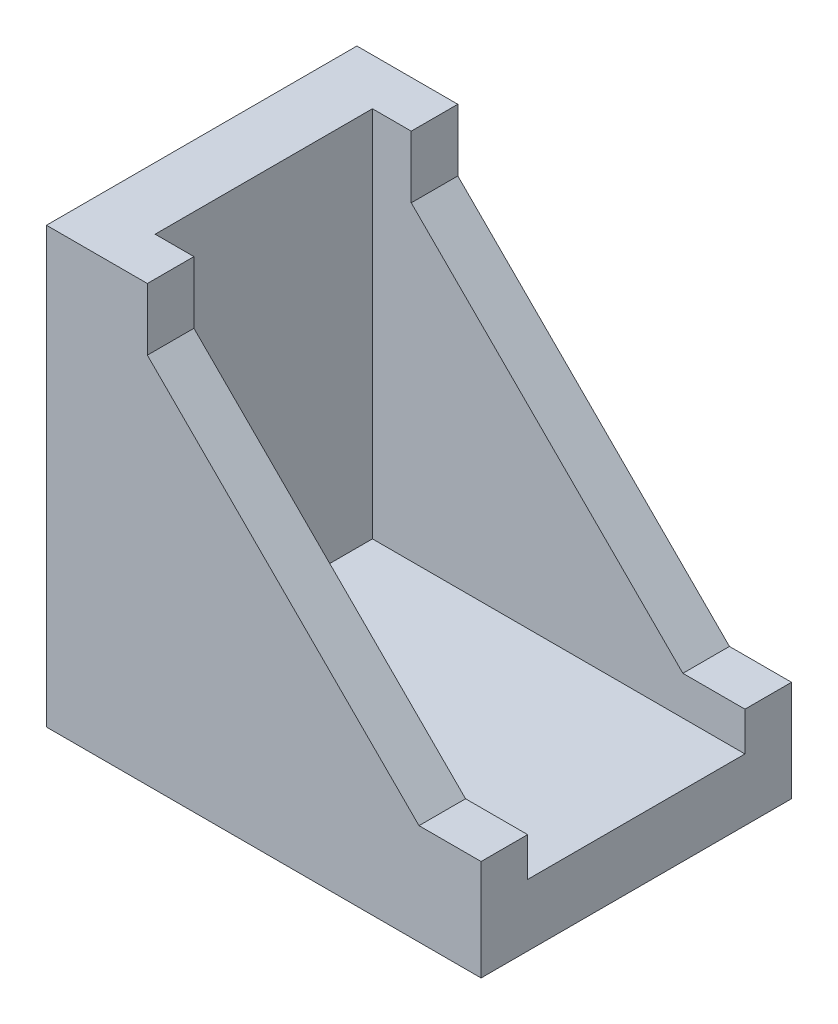
ISO-10303-21;
HEADER;
FILE_DESCRIPTION(('STEP AP214'),'2;1');
FILE_NAME('part.step','',(''),(''),'','','');
FILE_SCHEMA(('AUTOMOTIVE_DESIGN { 1 0 10303 214 1 1 1 1 }'));
ENDSEC;
DATA;
#1=APPLICATION_CONTEXT('core data for automotive mechanical design processes');
#2=APPLICATION_PROTOCOL_DEFINITION('international standard','automotive_design',2000,#1);
#3=PRODUCT_CONTEXT('',#1,'mechanical');
#4=PRODUCT('Part','Part','',(#3));
#5=PRODUCT_RELATED_PRODUCT_CATEGORY('part','',(#4));
#6=PRODUCT_DEFINITION_FORMATION('','',#4);
#7=PRODUCT_DEFINITION_CONTEXT('part definition',#1,'design');
#8=PRODUCT_DEFINITION('design','',#6,#7);
#9=PRODUCT_DEFINITION_SHAPE('','',#8);
#10=(LENGTH_UNIT() NAMED_UNIT(*) SI_UNIT(.MILLI.,.METRE.));
#11=(NAMED_UNIT(*) PLANE_ANGLE_UNIT() SI_UNIT($,.RADIAN.));
#12=(NAMED_UNIT(*) SI_UNIT($,.STERADIAN.) SOLID_ANGLE_UNIT());
#13=UNCERTAINTY_MEASURE_WITH_UNIT(LENGTH_MEASURE(1.E-05),#10,'distance_accuracy_value','');
#14=(GEOMETRIC_REPRESENTATION_CONTEXT(3) GLOBAL_UNCERTAINTY_ASSIGNED_CONTEXT((#13)) GLOBAL_UNIT_ASSIGNED_CONTEXT((#10,
#11,#12)) REPRESENTATION_CONTEXT('',''));
#15=CARTESIAN_POINT('',(0.,0.,0.));
#16=DIRECTION('',(0.,0.,1.));
#17=DIRECTION('',(1.,0.,0.));
#18=AXIS2_PLACEMENT_3D('',#15,#16,#17);
#19=CARTESIAN_POINT('',(14.,-7.5,20.));
#20=DIRECTION('',(0.,-1.,0.));
#21=DIRECTION('',(1.,0.,0.));
#22=AXIS2_PLACEMENT_3D('',#19,#20,#21);
#23=PLANE('',#22);
#24=DIRECTION('',(0.,0.,-1.));
#25=VECTOR('',#24,1.);
#26=CARTESIAN_POINT('',(10.,-7.5,20.));
#27=LINE('',#26,#25);
#28=CARTESIAN_POINT('',(10.,-7.5,3.));
#29=VERTEX_POINT('',#28);
#30=CARTESIAN_POINT('',(10.,-7.5,0.));
#31=VERTEX_POINT('',#30);
#32=EDGE_CURVE('E170',#29,#31,#27,.T.);
#33=ORIENTED_EDGE('',*,*,#32,.F.);
#34=DIRECTION('',(1.,0.,0.));
#35=VECTOR('',#34,1.);
#36=CARTESIAN_POINT('',(14.,-7.5,3.));
#37=LINE('',#36,#35);
#38=CARTESIAN_POINT('',(14.,-7.5,3.));
#39=VERTEX_POINT('',#38);
#40=EDGE_CURVE('E249',#29,#39,#37,.T.);
#41=ORIENTED_EDGE('',*,*,#40,.T.);
#42=DIRECTION('',(0.,0.,-1.));
#43=VECTOR('',#42,1.);
#44=CARTESIAN_POINT('',(14.,-7.5,20.));
#45=LINE('',#44,#43);
#46=CARTESIAN_POINT('',(14.,-7.5,0.));
#47=VERTEX_POINT('',#46);
#48=EDGE_CURVE('E174',#39,#47,#45,.T.);
#49=ORIENTED_EDGE('',*,*,#48,.T.);
#50=DIRECTION('',(-1.,0.,0.));
#51=VECTOR('',#50,1.);
#52=CARTESIAN_POINT('',(14.,-7.5,0.));
#53=LINE('',#52,#51);
#54=EDGE_CURVE('E147',#47,#31,#53,.T.);
#55=ORIENTED_EDGE('',*,*,#54,.T.);
#56=EDGE_LOOP('',(#33,#41,#49,#55));
#57=FACE_BOUND('',#56,.T.);
#58=ADVANCED_FACE('F40',(#57),#23,.F.);
#59=CARTESIAN_POINT('',(-7.5,10.,20.));
#60=DIRECTION('',(-0.707106781186548,-0.707106781186548,0.));
#61=DIRECTION('',(0.707106781186548,-0.707106781186548,0.));
#62=AXIS2_PLACEMENT_3D('',#59,#60,#61);
#63=PLANE('',#62);
#64=DIRECTION('',(0.,0.,-1.));
#65=VECTOR('',#64,1.);
#66=CARTESIAN_POINT('',(-7.5,10.,20.));
#67=LINE('',#66,#65);
#68=CARTESIAN_POINT('',(-7.5,10.,3.));
#69=VERTEX_POINT('',#68);
#70=CARTESIAN_POINT('',(-7.5,10.,0.));
#71=VERTEX_POINT('',#70);
#72=EDGE_CURVE('E166',#69,#71,#67,.T.);
#73=ORIENTED_EDGE('',*,*,#72,.F.);
#74=DIRECTION('',(0.707106781186548,-0.707106781186548,0.));
#75=VECTOR('',#74,1.);
#76=CARTESIAN_POINT('',(-7.5,10.,3.));
#77=LINE('',#76,#75);
#78=EDGE_CURVE('E260',#69,#29,#77,.T.);
#79=ORIENTED_EDGE('',*,*,#78,.T.);
#80=ORIENTED_EDGE('',*,*,#32,.T.);
#81=DIRECTION('',(-0.707106781186548,0.707106781186548,0.));
#82=VECTOR('',#81,1.);
#83=CARTESIAN_POINT('',(-7.5,10.,0.));
#84=LINE('',#83,#82);
#85=EDGE_CURVE('E151',#31,#71,#84,.T.);
#86=ORIENTED_EDGE('',*,*,#85,.T.);
#87=EDGE_LOOP('',(#73,#79,#80,#86));
#88=FACE_BOUND('',#87,.T.);
#89=ADVANCED_FACE('F262',(#88),#63,.F.);
#90=CARTESIAN_POINT('',(-7.5,14.,20.));
#91=DIRECTION('',(-1.,0.,0.));
#92=DIRECTION('',(0.,-1.,0.));
#93=AXIS2_PLACEMENT_3D('',#90,#91,#92);
#94=PLANE('',#93);
#95=DIRECTION('',(0.,0.,-1.));
#96=VECTOR('',#95,1.);
#97=CARTESIAN_POINT('',(-7.5,14.,20.));
#98=LINE('',#97,#96);
#99=CARTESIAN_POINT('',(-7.5,14.,3.));
#100=VERTEX_POINT('',#99);
#101=CARTESIAN_POINT('',(-7.5,14.,0.));
#102=VERTEX_POINT('',#101);
#103=EDGE_CURVE('E135',#100,#102,#98,.T.);
#104=ORIENTED_EDGE('',*,*,#103,.F.);
#105=DIRECTION('',(0.,-1.,0.));
#106=VECTOR('',#105,1.);
#107=CARTESIAN_POINT('',(-7.5,14.,3.));
#108=LINE('',#107,#106);
#109=EDGE_CURVE('E196',#100,#69,#108,.T.);
#110=ORIENTED_EDGE('',*,*,#109,.T.);
#111=ORIENTED_EDGE('',*,*,#72,.T.);
#112=DIRECTION('',(0.,1.,0.));
#113=VECTOR('',#112,1.);
#114=CARTESIAN_POINT('',(-7.5,14.,0.));
#115=LINE('',#114,#113);
#116=EDGE_CURVE('E154',#71,#102,#115,.T.);
#117=ORIENTED_EDGE('',*,*,#116,.T.);
#118=EDGE_LOOP('',(#104,#110,#111,#117));
#119=FACE_BOUND('',#118,.T.);
#120=ADVANCED_FACE('F195',(#119),#94,.F.);
#121=CARTESIAN_POINT('',(14.,-7.5,20.));
#122=DIRECTION('',(-1.,0.,0.));
#123=DIRECTION('',(0.,-1.,0.));
#124=AXIS2_PLACEMENT_3D('',#121,#122,#123);
#125=PLANE('',#124);
#126=ORIENTED_EDGE('',*,*,#48,.F.);
#127=DIRECTION('',(0.,-1.,0.));
#128=VECTOR('',#127,1.);
#129=CARTESIAN_POINT('',(14.,-7.5,3.));
#130=LINE('',#129,#128);
#131=CARTESIAN_POINT('',(14.,-10.,3.));
#132=VERTEX_POINT('',#131);
#133=EDGE_CURVE('E148',#39,#132,#130,.T.);
#134=ORIENTED_EDGE('',*,*,#133,.T.);
#135=DIRECTION('',(0.,0.,-1.));
#136=VECTOR('',#135,1.);
#137=CARTESIAN_POINT('',(14.,-10.,20.));
#138=LINE('',#137,#136);
#139=CARTESIAN_POINT('',(14.,-10.,17.));
#140=VERTEX_POINT('',#139);
#141=EDGE_CURVE('E12',#140,#132,#138,.T.);
#142=ORIENTED_EDGE('',*,*,#141,.F.);
#143=DIRECTION('',(0.,1.,0.));
#144=VECTOR('',#143,1.);
#145=CARTESIAN_POINT('',(14.,-7.5,17.));
#146=LINE('',#145,#144);
#147=CARTESIAN_POINT('',(14.,-7.5,17.));
#148=VERTEX_POINT('',#147);
#149=EDGE_CURVE('E264',#140,#148,#146,.T.);
#150=ORIENTED_EDGE('',*,*,#149,.T.);
#151=CARTESIAN_POINT('',(14.,-7.5,20.));
#152=VERTEX_POINT('',#151);
#153=EDGE_CURVE('E175',#152,#148,#45,.T.);
#154=ORIENTED_EDGE('',*,*,#153,.F.);
#155=DIRECTION('',(0.,1.,0.));
#156=VECTOR('',#155,1.);
#157=CARTESIAN_POINT('',(14.,-7.5,20.));
#158=LINE('',#157,#156);
#159=CARTESIAN_POINT('',(14.,-14.,20.));
#160=VERTEX_POINT('',#159);
#161=EDGE_CURVE('E161',#160,#152,#158,.T.);
#162=ORIENTED_EDGE('',*,*,#161,.F.);
#163=DIRECTION('',(0.,0.,-1.));
#164=VECTOR('',#163,1.);
#165=CARTESIAN_POINT('',(14.,-14.,20.));
#166=LINE('',#165,#164);
#167=CARTESIAN_POINT('',(14.,-14.,0.));
#168=VERTEX_POINT('',#167);
#169=EDGE_CURVE('E140',#160,#168,#166,.T.);
#170=ORIENTED_EDGE('',*,*,#169,.T.);
#171=DIRECTION('',(0.,1.,0.));
#172=VECTOR('',#171,1.);
#173=CARTESIAN_POINT('',(14.,-7.5,0.));
#174=LINE('',#173,#172);
#175=EDGE_CURVE('E144',#168,#47,#174,.T.);
#176=ORIENTED_EDGE('',*,*,#175,.T.);
#177=EDGE_LOOP('',(#126,#134,#142,#150,#154,#162,#170,#176));
#178=FACE_BOUND('',#177,.T.);
#179=ADVANCED_FACE('F42',(#178),#125,.F.);
#180=ORIENTED_EDGE('',*,*,#153,.T.);
#181=DIRECTION('',(-1.,0.,0.));
#182=VECTOR('',#181,1.);
#183=CARTESIAN_POINT('',(14.,-7.5,17.));
#184=LINE('',#183,#182);
#185=CARTESIAN_POINT('',(10.,-7.5,17.));
#186=VERTEX_POINT('',#185);
#187=EDGE_CURVE('E268',#148,#186,#184,.T.);
#188=ORIENTED_EDGE('',*,*,#187,.T.);
#189=CARTESIAN_POINT('',(10.,-7.5,20.));
#190=VERTEX_POINT('',#189);
#191=EDGE_CURVE('E171',#190,#186,#27,.T.);
#192=ORIENTED_EDGE('',*,*,#191,.F.);
#193=DIRECTION('',(-1.,0.,0.));
#194=VECTOR('',#193,1.);
#195=CARTESIAN_POINT('',(14.,-7.5,20.));
#196=LINE('',#195,#194);
#197=EDGE_CURVE('E103',#152,#190,#196,.T.);
#198=ORIENTED_EDGE('',*,*,#197,.F.);
#199=EDGE_LOOP('',(#180,#188,#192,#198));
#200=FACE_BOUND('',#199,.T.);
#201=ADVANCED_FACE('F288',(#200),#23,.F.);
#202=ORIENTED_EDGE('',*,*,#191,.T.);
#203=DIRECTION('',(-0.707106781186548,0.707106781186548,0.));
#204=VECTOR('',#203,1.);
#205=CARTESIAN_POINT('',(-7.5,10.,17.));
#206=LINE('',#205,#204);
#207=CARTESIAN_POINT('',(-7.5,10.,17.));
#208=VERTEX_POINT('',#207);
#209=EDGE_CURVE('E222',#186,#208,#206,.T.);
#210=ORIENTED_EDGE('',*,*,#209,.T.);
#211=CARTESIAN_POINT('',(-7.5,10.,20.));
#212=VERTEX_POINT('',#211);
#213=EDGE_CURVE('E167',#212,#208,#67,.T.);
#214=ORIENTED_EDGE('',*,*,#213,.F.);
#215=DIRECTION('',(-0.707106781186548,0.707106781186548,0.));
#216=VECTOR('',#215,1.);
#217=CARTESIAN_POINT('',(-7.5,10.,20.));
#218=LINE('',#217,#216);
#219=EDGE_CURVE('E210',#190,#212,#218,.T.);
#220=ORIENTED_EDGE('',*,*,#219,.F.);
#221=EDGE_LOOP('',(#202,#210,#214,#220));
#222=FACE_BOUND('',#221,.T.);
#223=ADVANCED_FACE('F219',(#222),#63,.F.);
#224=ORIENTED_EDGE('',*,*,#213,.T.);
#225=DIRECTION('',(0.,1.,0.));
#226=VECTOR('',#225,1.);
#227=CARTESIAN_POINT('',(-7.5,14.,17.));
#228=LINE('',#227,#226);
#229=CARTESIAN_POINT('',(-7.5,14.,17.));
#230=VERTEX_POINT('',#229);
#231=EDGE_CURVE('E228',#208,#230,#228,.T.);
#232=ORIENTED_EDGE('',*,*,#231,.T.);
#233=CARTESIAN_POINT('',(-7.5,14.,20.));
#234=VERTEX_POINT('',#233);
#235=EDGE_CURVE('E164',#234,#230,#98,.T.);
#236=ORIENTED_EDGE('',*,*,#235,.F.);
#237=DIRECTION('',(0.,1.,0.));
#238=VECTOR('',#237,1.);
#239=CARTESIAN_POINT('',(-7.5,14.,20.));
#240=LINE('',#239,#238);
#241=EDGE_CURVE('E122',#212,#234,#240,.T.);
#242=ORIENTED_EDGE('',*,*,#241,.F.);
#243=EDGE_LOOP('',(#224,#232,#236,#242));
#244=FACE_BOUND('',#243,.T.);
#245=ADVANCED_FACE('F225',(#244),#94,.F.);
#246=CARTESIAN_POINT('',(-14.,14.,20.));
#247=DIRECTION('',(0.,-1.,0.));
#248=DIRECTION('',(1.,0.,0.));
#249=AXIS2_PLACEMENT_3D('',#246,#247,#248);
#250=PLANE('',#249);
#251=DIRECTION('',(0.,0.,1.));
#252=VECTOR('',#251,1.);
#253=CARTESIAN_POINT('',(-10.,14.,20.));
#254=LINE('',#253,#252);
#255=CARTESIAN_POINT('',(-10.,14.,3.));
#256=VERTEX_POINT('',#255);
#257=CARTESIAN_POINT('',(-10.,14.,17.));
#258=VERTEX_POINT('',#257);
#259=EDGE_CURVE('E180',#256,#258,#254,.T.);
#260=ORIENTED_EDGE('',*,*,#259,.F.);
#261=DIRECTION('',(1.,0.,0.));
#262=VECTOR('',#261,1.);
#263=CARTESIAN_POINT('',(-14.,14.,3.));
#264=LINE('',#263,#262);
#265=EDGE_CURVE('E48',#256,#100,#264,.T.);
#266=ORIENTED_EDGE('',*,*,#265,.T.);
#267=ORIENTED_EDGE('',*,*,#103,.T.);
#268=DIRECTION('',(-1.,0.,0.));
#269=VECTOR('',#268,1.);
#270=CARTESIAN_POINT('',(-14.,14.,0.));
#271=LINE('',#270,#269);
#272=CARTESIAN_POINT('',(-14.,14.,0.));
#273=VERTEX_POINT('',#272);
#274=EDGE_CURVE('E132',#102,#273,#271,.T.);
#275=ORIENTED_EDGE('',*,*,#274,.T.);
#276=DIRECTION('',(0.,0.,-1.));
#277=VECTOR('',#276,1.);
#278=CARTESIAN_POINT('',(-14.,14.,20.));
#279=LINE('',#278,#277);
#280=CARTESIAN_POINT('',(-14.,14.,20.));
#281=VERTEX_POINT('',#280);
#282=EDGE_CURVE('E128',#281,#273,#279,.T.);
#283=ORIENTED_EDGE('',*,*,#282,.F.);
#284=DIRECTION('',(-1.,0.,0.));
#285=VECTOR('',#284,1.);
#286=CARTESIAN_POINT('',(-14.,14.,20.));
#287=LINE('',#286,#285);
#288=EDGE_CURVE('E115',#234,#281,#287,.T.);
#289=ORIENTED_EDGE('',*,*,#288,.F.);
#290=ORIENTED_EDGE('',*,*,#235,.T.);
#291=DIRECTION('',(-1.,0.,0.));
#292=VECTOR('',#291,1.);
#293=CARTESIAN_POINT('',(-14.,14.,17.));
#294=LINE('',#293,#292);
#295=EDGE_CURVE('E177',#230,#258,#294,.T.);
#296=ORIENTED_EDGE('',*,*,#295,.T.);
#297=EDGE_LOOP('',(#260,#266,#267,#275,#283,#289,#290,#296));
#298=FACE_BOUND('',#297,.T.);
#299=ADVANCED_FACE('F130',(#298),#250,.F.);
#300=CARTESIAN_POINT('',(-14.,14.,20.));
#301=DIRECTION('',(1.,0.,0.));
#302=DIRECTION('',(0.,1.,0.));
#303=AXIS2_PLACEMENT_3D('',#300,#301,#302);
#304=PLANE('',#303);
#305=DIRECTION('',(0.,-1.,0.));
#306=VECTOR('',#305,1.);
#307=CARTESIAN_POINT('',(-14.,14.,0.));
#308=LINE('',#307,#306);
#309=CARTESIAN_POINT('',(-14.,-14.,0.));
#310=VERTEX_POINT('',#309);
#311=EDGE_CURVE('E158',#273,#310,#308,.T.);
#312=ORIENTED_EDGE('',*,*,#311,.T.);
#313=DIRECTION('',(0.,0.,-1.));
#314=VECTOR('',#313,1.);
#315=CARTESIAN_POINT('',(-14.,-14.,20.));
#316=LINE('',#315,#314);
#317=CARTESIAN_POINT('',(-14.,-14.,20.));
#318=VERTEX_POINT('',#317);
#319=EDGE_CURVE('E136',#318,#310,#316,.T.);
#320=ORIENTED_EDGE('',*,*,#319,.F.);
#321=DIRECTION('',(0.,-1.,0.));
#322=VECTOR('',#321,1.);
#323=CARTESIAN_POINT('',(-14.,14.,20.));
#324=LINE('',#323,#322);
#325=EDGE_CURVE('E119',#281,#318,#324,.T.);
#326=ORIENTED_EDGE('',*,*,#325,.F.);
#327=ORIENTED_EDGE('',*,*,#282,.T.);
#328=EDGE_LOOP('',(#312,#320,#326,#327));
#329=FACE_BOUND('',#328,.T.);
#330=ADVANCED_FACE('F138',(#329),#304,.F.);
#331=CARTESIAN_POINT('',(-14.,-14.,20.));
#332=DIRECTION('',(0.,1.,0.));
#333=DIRECTION('',(0.,0.,1.));
#334=AXIS2_PLACEMENT_3D('',#331,#332,#333);
#335=PLANE('',#334);
#336=DIRECTION('',(1.,0.,0.));
#337=VECTOR('',#336,1.);
#338=CARTESIAN_POINT('',(-14.,-14.,0.));
#339=LINE('',#338,#337);
#340=EDGE_CURVE('E94',#310,#168,#339,.T.);
#341=ORIENTED_EDGE('',*,*,#340,.T.);
#342=ORIENTED_EDGE('',*,*,#169,.F.);
#343=DIRECTION('',(1.,0.,0.));
#344=VECTOR('',#343,1.);
#345=CARTESIAN_POINT('',(-14.,-14.,20.));
#346=LINE('',#345,#344);
#347=EDGE_CURVE('E64',#318,#160,#346,.T.);
#348=ORIENTED_EDGE('',*,*,#347,.F.);
#349=ORIENTED_EDGE('',*,*,#319,.T.);
#350=EDGE_LOOP('',(#341,#342,#348,#349));
#351=FACE_BOUND('',#350,.T.);
#352=ADVANCED_FACE('F203',(#351),#335,.F.);
#353=CARTESIAN_POINT('',(0.,0.,20.));
#354=DIRECTION('',(0.,0.,1.));
#355=DIRECTION('',(1.,0.,0.));
#356=AXIS2_PLACEMENT_3D('',#353,#354,#355);
#357=PLANE('',#356);
#358=ORIENTED_EDGE('',*,*,#161,.T.);
#359=ORIENTED_EDGE('',*,*,#197,.T.);
#360=ORIENTED_EDGE('',*,*,#219,.T.);
#361=ORIENTED_EDGE('',*,*,#241,.T.);
#362=ORIENTED_EDGE('',*,*,#288,.T.);
#363=ORIENTED_EDGE('',*,*,#325,.T.);
#364=ORIENTED_EDGE('',*,*,#347,.T.);
#365=EDGE_LOOP('',(#358,#359,#360,#361,#362,#363,#364));
#366=FACE_BOUND('',#365,.T.);
#367=ADVANCED_FACE('F117',(#366),#357,.T.);
#368=CARTESIAN_POINT('',(0.,0.,0.));
#369=DIRECTION('',(0.,0.,1.));
#370=DIRECTION('',(1.,0.,0.));
#371=AXIS2_PLACEMENT_3D('',#368,#369,#370);
#372=PLANE('',#371);
#373=ORIENTED_EDGE('',*,*,#175,.F.);
#374=ORIENTED_EDGE('',*,*,#340,.F.);
#375=ORIENTED_EDGE('',*,*,#311,.F.);
#376=ORIENTED_EDGE('',*,*,#274,.F.);
#377=ORIENTED_EDGE('',*,*,#116,.F.);
#378=ORIENTED_EDGE('',*,*,#85,.F.);
#379=ORIENTED_EDGE('',*,*,#54,.F.);
#380=EDGE_LOOP('',(#373,#374,#375,#376,#377,#378,#379));
#381=FACE_BOUND('',#380,.T.);
#382=ADVANCED_FACE('F202',(#381),#372,.F.);
#383=CARTESIAN_POINT('',(-10.,-10.,55.828306201676));
#384=DIRECTION('',(0.,1.,0.));
#385=DIRECTION('',(0.,0.,1.));
#386=AXIS2_PLACEMENT_3D('',#383,#384,#385);
#387=PLANE('',#386);
#388=ORIENTED_EDGE('',*,*,#141,.T.);
#389=DIRECTION('',(1.,0.,0.));
#390=VECTOR('',#389,1.);
#391=CARTESIAN_POINT('',(-10.,-10.,3.));
#392=LINE('',#391,#390);
#393=CARTESIAN_POINT('',(-10.,-10.,3.));
#394=VERTEX_POINT('',#393);
#395=EDGE_CURVE('E255',#394,#132,#392,.T.);
#396=ORIENTED_EDGE('',*,*,#395,.F.);
#397=DIRECTION('',(0.,0.,-1.));
#398=VECTOR('',#397,1.);
#399=CARTESIAN_POINT('',(-10.,-10.,55.828306201676));
#400=LINE('',#399,#398);
#401=CARTESIAN_POINT('',(-10.,-10.,17.));
#402=VERTEX_POINT('',#401);
#403=EDGE_CURVE('E274',#402,#394,#400,.T.);
#404=ORIENTED_EDGE('',*,*,#403,.F.);
#405=DIRECTION('',(1.,0.,0.));
#406=VECTOR('',#405,1.);
#407=CARTESIAN_POINT('',(-10.,-10.,17.));
#408=LINE('',#407,#406);
#409=EDGE_CURVE('E273',#402,#140,#408,.T.);
#410=ORIENTED_EDGE('',*,*,#409,.T.);
#411=EDGE_LOOP('',(#388,#396,#404,#410));
#412=FACE_BOUND('',#411,.T.);
#413=ADVANCED_FACE('F287',(#412),#387,.T.);
#414=CARTESIAN_POINT('',(-10.,-10.,55.828306201676));
#415=DIRECTION('',(1.,0.,0.));
#416=DIRECTION('',(0.,0.,-1.));
#417=AXIS2_PLACEMENT_3D('',#414,#415,#416);
#418=PLANE('',#417);
#419=ORIENTED_EDGE('',*,*,#259,.T.);
#420=DIRECTION('',(0.,-1.,0.));
#421=VECTOR('',#420,1.);
#422=CARTESIAN_POINT('',(-10.,-10.,17.));
#423=LINE('',#422,#421);
#424=EDGE_CURVE('E55',#258,#402,#423,.T.);
#425=ORIENTED_EDGE('',*,*,#424,.T.);
#426=ORIENTED_EDGE('',*,*,#403,.T.);
#427=DIRECTION('',(0.,-1.,0.));
#428=VECTOR('',#427,1.);
#429=CARTESIAN_POINT('',(-10.,-10.,3.));
#430=LINE('',#429,#428);
#431=EDGE_CURVE('E277',#256,#394,#430,.T.);
#432=ORIENTED_EDGE('',*,*,#431,.F.);
#433=EDGE_LOOP('',(#419,#425,#426,#432));
#434=FACE_BOUND('',#433,.T.);
#435=ADVANCED_FACE('F285',(#434),#418,.T.);
#436=CARTESIAN_POINT('',(0.,0.,3.));
#437=DIRECTION('',(0.,0.,-1.));
#438=DIRECTION('',(-1.,0.,0.));
#439=AXIS2_PLACEMENT_3D('',#436,#437,#438);
#440=PLANE('',#439);
#441=ORIENTED_EDGE('',*,*,#40,.F.);
#442=ORIENTED_EDGE('',*,*,#78,.F.);
#443=ORIENTED_EDGE('',*,*,#109,.F.);
#444=ORIENTED_EDGE('',*,*,#265,.F.);
#445=ORIENTED_EDGE('',*,*,#431,.T.);
#446=ORIENTED_EDGE('',*,*,#395,.T.);
#447=ORIENTED_EDGE('',*,*,#133,.F.);
#448=EDGE_LOOP('',(#441,#442,#443,#444,#445,#446,#447));
#449=FACE_BOUND('',#448,.T.);
#450=ADVANCED_FACE('F253',(#449),#440,.F.);
#451=CARTESIAN_POINT('',(0.,0.,17.));
#452=DIRECTION('',(0.,0.,1.));
#453=DIRECTION('',(1.,0.,0.));
#454=AXIS2_PLACEMENT_3D('',#451,#452,#453);
#455=PLANE('',#454);
#456=ORIENTED_EDGE('',*,*,#409,.F.);
#457=ORIENTED_EDGE('',*,*,#424,.F.);
#458=ORIENTED_EDGE('',*,*,#295,.F.);
#459=ORIENTED_EDGE('',*,*,#231,.F.);
#460=ORIENTED_EDGE('',*,*,#209,.F.);
#461=ORIENTED_EDGE('',*,*,#187,.F.);
#462=ORIENTED_EDGE('',*,*,#149,.F.);
#463=EDGE_LOOP('',(#456,#457,#458,#459,#460,#461,#462));
#464=FACE_BOUND('',#463,.T.);
#465=ADVANCED_FACE('F289',(#464),#455,.F.);
#466=CLOSED_SHELL('',(#58,#89,#120,#179,#201,#223,#245,#299,#330,#352,#367,#382,#413,#435,#450,#465));
#467=MANIFOLD_SOLID_BREP('B2',#466);
#468=ADVANCED_BREP_SHAPE_REPRESENTATION('',(#18,#467),#14);
#469=SHAPE_DEFINITION_REPRESENTATION(#9,#468);
ENDSEC;
END-ISO-10303-21;
